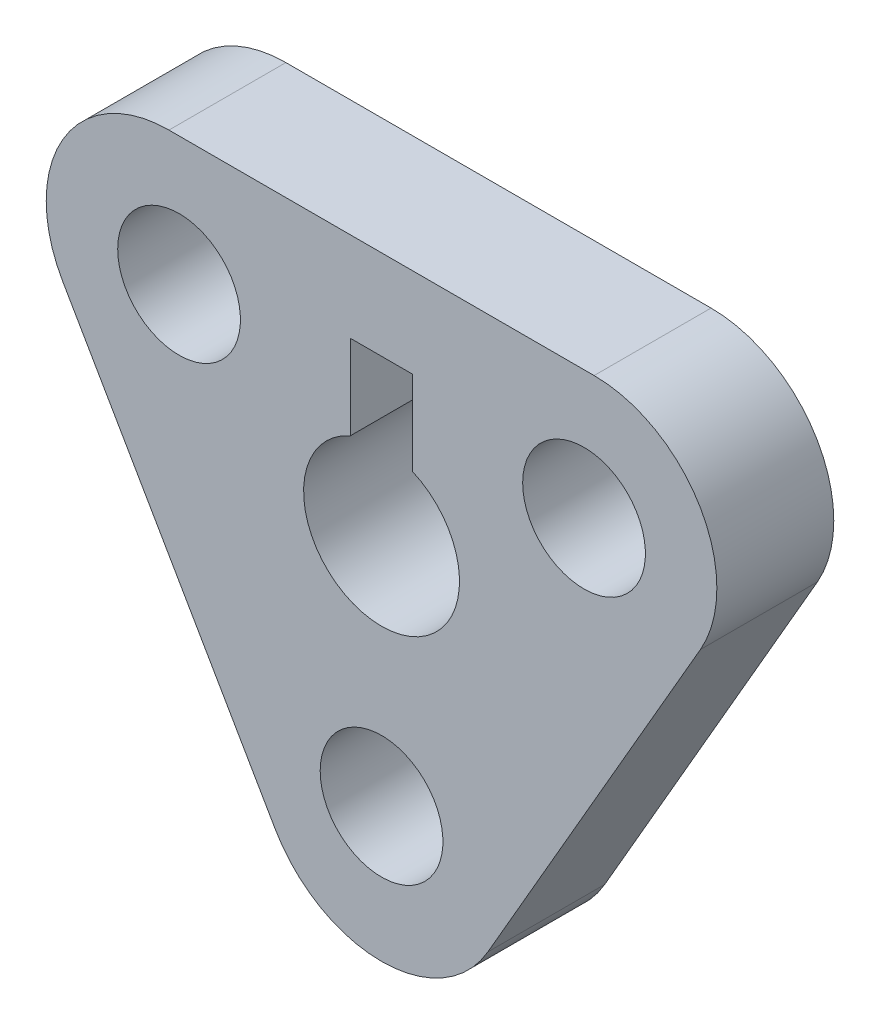
ISO-10303-21;
HEADER;
FILE_DESCRIPTION(('STEP AP214'),'2;1');
FILE_NAME('part.step','',(''),(''),'','','');
FILE_SCHEMA(('AUTOMOTIVE_DESIGN { 1 0 10303 214 1 1 1 1 }'));
ENDSEC;
DATA;
#1=APPLICATION_CONTEXT('core data for automotive mechanical design processes');
#2=APPLICATION_PROTOCOL_DEFINITION('international standard','automotive_design',2000,#1);
#3=PRODUCT_CONTEXT('',#1,'mechanical');
#4=PRODUCT('Part','Part','',(#3));
#5=PRODUCT_RELATED_PRODUCT_CATEGORY('part','',(#4));
#6=PRODUCT_DEFINITION_FORMATION('','',#4);
#7=PRODUCT_DEFINITION_CONTEXT('part definition',#1,'design');
#8=PRODUCT_DEFINITION('design','',#6,#7);
#9=PRODUCT_DEFINITION_SHAPE('','',#8);
#10=(LENGTH_UNIT() NAMED_UNIT(*) SI_UNIT(.MILLI.,.METRE.));
#11=(NAMED_UNIT(*) PLANE_ANGLE_UNIT() SI_UNIT($,.RADIAN.));
#12=(NAMED_UNIT(*) SI_UNIT($,.STERADIAN.) SOLID_ANGLE_UNIT());
#13=UNCERTAINTY_MEASURE_WITH_UNIT(LENGTH_MEASURE(1.E-05),#10,'distance_accuracy_value','');
#14=(GEOMETRIC_REPRESENTATION_CONTEXT(3) GLOBAL_UNCERTAINTY_ASSIGNED_CONTEXT((#13)) GLOBAL_UNIT_ASSIGNED_CONTEXT((#10,
#11,#12)) REPRESENTATION_CONTEXT('',''));
#15=CARTESIAN_POINT('',(0.,0.,0.));
#16=DIRECTION('',(0.,0.,1.));
#17=DIRECTION('',(1.,0.,0.));
#18=AXIS2_PLACEMENT_3D('',#15,#16,#17);
#19=CARTESIAN_POINT('',(0.,0.,9.525));
#20=DIRECTION('',(0.,0.,1.));
#21=DIRECTION('',(1.,0.,0.));
#22=AXIS2_PLACEMENT_3D('',#19,#20,#21);
#23=PLANE('',#22);
#24=CARTESIAN_POINT('',(16.4977839420936,9.52499999999999,9.525));
#25=DIRECTION('',(0.,0.,1.));
#26=DIRECTION('',(1.,0.,0.));
#27=AXIS2_PLACEMENT_3D('',#24,#25,#26);
#28=CIRCLE('',#27,5.);
#29=CARTESIAN_POINT('',(11.4977839420936,9.52499999999999,9.525));
#30=VERTEX_POINT('',#29);
#31=EDGE_CURVE('E147',#30,#30,#28,.T.);
#32=ORIENTED_EDGE('',*,*,#31,.F.);
#33=EDGE_LOOP('',(#32));
#34=FACE_BOUND('',#33,.T.);
#35=DIRECTION('',(0.5,-0.866025403784439,0.));
#36=VECTOR('',#35,1.);
#37=CARTESIAN_POINT('',(-34.6410161513775,20.,9.525));
#38=LINE('',#37,#36);
#39=CARTESIAN_POINT('',(-25.9807621135332,5.00000000000001,9.525));
#40=VERTEX_POINT('',#39);
#41=CARTESIAN_POINT('',(-8.6602540378444,-25.,9.525));
#42=VERTEX_POINT('',#41);
#43=EDGE_CURVE('E166',#40,#42,#38,.T.);
#44=ORIENTED_EDGE('',*,*,#43,.T.);
#45=CARTESIAN_POINT('',(0.,-20.,9.525));
#46=DIRECTION('',(0.,0.,1.));
#47=DIRECTION('',(1.,0.,0.));
#48=AXIS2_PLACEMENT_3D('',#45,#46,#47);
#49=CIRCLE('',#48,10.);
#50=CARTESIAN_POINT('',(8.66025403784437,-25.,9.525));
#51=VERTEX_POINT('',#50);
#52=EDGE_CURVE('E199',#42,#51,#49,.T.);
#53=ORIENTED_EDGE('',*,*,#52,.T.);
#54=DIRECTION('',(0.5,0.866025403784439,0.));
#55=VECTOR('',#54,1.);
#56=CARTESIAN_POINT('',(0.,-40.,9.525));
#57=LINE('',#56,#55);
#58=CARTESIAN_POINT('',(25.9807621135332,5.00000000000002,9.525));
#59=VERTEX_POINT('',#58);
#60=EDGE_CURVE('E170',#51,#59,#57,.T.);
#61=ORIENTED_EDGE('',*,*,#60,.T.);
#62=CARTESIAN_POINT('',(17.3205080756888,10.,9.525));
#63=DIRECTION('',(0.,0.,1.));
#64=DIRECTION('',(1.,0.,0.));
#65=AXIS2_PLACEMENT_3D('',#62,#63,#64);
#66=CIRCLE('',#65,10.);
#67=CARTESIAN_POINT('',(17.3205080756888,20.,9.525));
#68=VERTEX_POINT('',#67);
#69=EDGE_CURVE('E195',#59,#68,#66,.T.);
#70=ORIENTED_EDGE('',*,*,#69,.T.);
#71=DIRECTION('',(-1.,0.,0.));
#72=VECTOR('',#71,1.);
#73=CARTESIAN_POINT('',(34.6410161513775,20.,9.525));
#74=LINE('',#73,#72);
#75=CARTESIAN_POINT('',(-17.3205080756888,20.,9.525));
#76=VERTEX_POINT('',#75);
#77=EDGE_CURVE('E164',#68,#76,#74,.T.);
#78=ORIENTED_EDGE('',*,*,#77,.T.);
#79=CARTESIAN_POINT('',(-17.3205080756888,10.,9.525));
#80=DIRECTION('',(0.,0.,1.));
#81=DIRECTION('',(1.,0.,0.));
#82=AXIS2_PLACEMENT_3D('',#79,#80,#81);
#83=CIRCLE('',#82,10.);
#84=EDGE_CURVE('E197',#76,#40,#83,.T.);
#85=ORIENTED_EDGE('',*,*,#84,.T.);
#86=EDGE_LOOP('',(#44,#53,#61,#70,#78,#85));
#87=FACE_BOUND('',#86,.T.);
#88=CARTESIAN_POINT('',(-16.4977839420935,9.52500000000002,9.525));
#89=DIRECTION('',(0.,0.,1.));
#90=DIRECTION('',(1.,0.,0.));
#91=AXIS2_PLACEMENT_3D('',#88,#89,#90);
#92=CIRCLE('',#91,5.);
#93=CARTESIAN_POINT('',(-21.4977839420935,9.52500000000002,9.525));
#94=VERTEX_POINT('',#93);
#95=EDGE_CURVE('E153',#94,#94,#92,.T.);
#96=ORIENTED_EDGE('',*,*,#95,.F.);
#97=EDGE_LOOP('',(#96));
#98=FACE_BOUND('',#97,.T.);
#99=CARTESIAN_POINT('',(0.,-19.05,9.525));
#100=DIRECTION('',(0.,0.,1.));
#101=DIRECTION('',(1.,0.,0.));
#102=AXIS2_PLACEMENT_3D('',#99,#100,#101);
#103=CIRCLE('',#102,5.);
#104=CARTESIAN_POINT('',(-5.00000000000001,-19.05,9.525));
#105=VERTEX_POINT('',#104);
#106=EDGE_CURVE('E141',#105,#105,#103,.T.);
#107=ORIENTED_EDGE('',*,*,#106,.F.);
#108=EDGE_LOOP('',(#107));
#109=FACE_BOUND('',#108,.T.);
#110=CARTESIAN_POINT('',(0.,0.,9.525));
#111=DIRECTION('',(0.,0.,1.));
#112=DIRECTION('',(1.,0.,0.));
#113=AXIS2_PLACEMENT_3D('',#110,#111,#112);
#114=CIRCLE('',#113,6.35);
#115=CARTESIAN_POINT('',(-2.54,5.81987113259392,9.525));
#116=VERTEX_POINT('',#115);
#117=CARTESIAN_POINT('',(2.54,5.81987113259392,9.525));
#118=VERTEX_POINT('',#117);
#119=EDGE_CURVE('E159',#116,#118,#114,.T.);
#120=ORIENTED_EDGE('',*,*,#119,.F.);
#121=DIRECTION('',(0.,-1.,0.));
#122=VECTOR('',#121,1.);
#123=CARTESIAN_POINT('',(-2.54,12.7,9.525));
#124=LINE('',#123,#122);
#125=CARTESIAN_POINT('',(-2.54,12.7,9.525));
#126=VERTEX_POINT('',#125);
#127=EDGE_CURVE('E121',#126,#116,#124,.T.);
#128=ORIENTED_EDGE('',*,*,#127,.F.);
#129=DIRECTION('',(-1.,0.,0.));
#130=VECTOR('',#129,1.);
#131=CARTESIAN_POINT('',(-2.54,12.7,9.525));
#132=LINE('',#131,#130);
#133=CARTESIAN_POINT('',(2.54,12.7,9.525));
#134=VERTEX_POINT('',#133);
#135=EDGE_CURVE('E120',#134,#126,#132,.T.);
#136=ORIENTED_EDGE('',*,*,#135,.F.);
#137=DIRECTION('',(0.,1.,0.));
#138=VECTOR('',#137,1.);
#139=CARTESIAN_POINT('',(2.54,12.7,9.525));
#140=LINE('',#139,#138);
#141=EDGE_CURVE('E111',#118,#134,#140,.T.);
#142=ORIENTED_EDGE('',*,*,#141,.F.);
#143=EDGE_LOOP('',(#120,#128,#136,#142));
#144=FACE_BOUND('',#143,.T.);
#145=ADVANCED_FACE('F34',(#34,#87,#98,#109,#144),#23,.T.);
#146=CARTESIAN_POINT('',(0.,0.,0.));
#147=DIRECTION('',(0.,0.,1.));
#148=DIRECTION('',(1.,0.,0.));
#149=AXIS2_PLACEMENT_3D('',#146,#147,#148);
#150=PLANE('',#149);
#151=CARTESIAN_POINT('',(0.,-19.05,0.));
#152=DIRECTION('',(0.,0.,1.));
#153=DIRECTION('',(1.,0.,0.));
#154=AXIS2_PLACEMENT_3D('',#151,#152,#153);
#155=CIRCLE('',#154,5.);
#156=CARTESIAN_POINT('',(-5.00000000000001,-19.05,0.));
#157=VERTEX_POINT('',#156);
#158=EDGE_CURVE('E128',#157,#157,#155,.T.);
#159=ORIENTED_EDGE('',*,*,#158,.T.);
#160=EDGE_LOOP('',(#159));
#161=FACE_BOUND('',#160,.T.);
#162=CARTESIAN_POINT('',(16.4977839420936,9.52499999999999,0.));
#163=DIRECTION('',(0.,0.,1.));
#164=DIRECTION('',(1.,0.,0.));
#165=AXIS2_PLACEMENT_3D('',#162,#163,#164);
#166=CIRCLE('',#165,5.);
#167=CARTESIAN_POINT('',(11.4977839420936,9.52499999999999,0.));
#168=VERTEX_POINT('',#167);
#169=EDGE_CURVE('E144',#168,#168,#166,.T.);
#170=ORIENTED_EDGE('',*,*,#169,.T.);
#171=EDGE_LOOP('',(#170));
#172=FACE_BOUND('',#171,.T.);
#173=CARTESIAN_POINT('',(-16.4977839420935,9.52500000000002,0.));
#174=DIRECTION('',(0.,0.,1.));
#175=DIRECTION('',(1.,0.,0.));
#176=AXIS2_PLACEMENT_3D('',#173,#174,#175);
#177=CIRCLE('',#176,5.);
#178=CARTESIAN_POINT('',(-21.4977839420935,9.52500000000002,0.));
#179=VERTEX_POINT('',#178);
#180=EDGE_CURVE('E150',#179,#179,#177,.T.);
#181=ORIENTED_EDGE('',*,*,#180,.T.);
#182=EDGE_LOOP('',(#181));
#183=FACE_BOUND('',#182,.T.);
#184=DIRECTION('',(0.5,0.866025403784439,0.));
#185=VECTOR('',#184,1.);
#186=CARTESIAN_POINT('',(0.,-40.,0.));
#187=LINE('',#186,#185);
#188=CARTESIAN_POINT('',(8.66025403784437,-25.,0.));
#189=VERTEX_POINT('',#188);
#190=CARTESIAN_POINT('',(25.9807621135332,5.00000000000002,0.));
#191=VERTEX_POINT('',#190);
#192=EDGE_CURVE('E167',#189,#191,#187,.T.);
#193=ORIENTED_EDGE('',*,*,#192,.F.);
#194=CARTESIAN_POINT('',(0.,-20.,0.));
#195=DIRECTION('',(0.,0.,1.));
#196=DIRECTION('',(1.,0.,0.));
#197=AXIS2_PLACEMENT_3D('',#194,#195,#196);
#198=CIRCLE('',#197,10.);
#199=CARTESIAN_POINT('',(-8.6602540378444,-25.,0.));
#200=VERTEX_POINT('',#199);
#201=EDGE_CURVE('E188',#189,#200,#198,.F.);
#202=ORIENTED_EDGE('',*,*,#201,.T.);
#203=DIRECTION('',(0.5,-0.866025403784439,0.));
#204=VECTOR('',#203,1.);
#205=CARTESIAN_POINT('',(-34.6410161513775,20.,0.));
#206=LINE('',#205,#204);
#207=CARTESIAN_POINT('',(-25.9807621135332,5.00000000000001,0.));
#208=VERTEX_POINT('',#207);
#209=EDGE_CURVE('E175',#208,#200,#206,.T.);
#210=ORIENTED_EDGE('',*,*,#209,.F.);
#211=CARTESIAN_POINT('',(-17.3205080756888,10.,0.));
#212=DIRECTION('',(0.,0.,1.));
#213=DIRECTION('',(1.,0.,0.));
#214=AXIS2_PLACEMENT_3D('',#211,#212,#213);
#215=CIRCLE('',#214,10.);
#216=CARTESIAN_POINT('',(-17.3205080756888,20.,0.));
#217=VERTEX_POINT('',#216);
#218=EDGE_CURVE('E186',#208,#217,#215,.F.);
#219=ORIENTED_EDGE('',*,*,#218,.T.);
#220=DIRECTION('',(-1.,0.,0.));
#221=VECTOR('',#220,1.);
#222=CARTESIAN_POINT('',(34.6410161513775,20.,0.));
#223=LINE('',#222,#221);
#224=CARTESIAN_POINT('',(17.3205080756888,20.,0.));
#225=VERTEX_POINT('',#224);
#226=EDGE_CURVE('E161',#225,#217,#223,.T.);
#227=ORIENTED_EDGE('',*,*,#226,.F.);
#228=CARTESIAN_POINT('',(17.3205080756888,10.,0.));
#229=DIRECTION('',(0.,0.,1.));
#230=DIRECTION('',(1.,0.,0.));
#231=AXIS2_PLACEMENT_3D('',#228,#229,#230);
#232=CIRCLE('',#231,10.);
#233=EDGE_CURVE('E184',#225,#191,#232,.F.);
#234=ORIENTED_EDGE('',*,*,#233,.T.);
#235=EDGE_LOOP('',(#193,#202,#210,#219,#227,#234));
#236=FACE_BOUND('',#235,.T.);
#237=DIRECTION('',(0.,-1.,0.));
#238=VECTOR('',#237,1.);
#239=CARTESIAN_POINT('',(-2.54,12.7,0.));
#240=LINE('',#239,#238);
#241=CARTESIAN_POINT('',(-2.54,12.7,0.));
#242=VERTEX_POINT('',#241);
#243=CARTESIAN_POINT('',(-2.54,5.81987113259392,0.));
#244=VERTEX_POINT('',#243);
#245=EDGE_CURVE('E136',#242,#244,#240,.T.);
#246=ORIENTED_EDGE('',*,*,#245,.T.);
#247=CARTESIAN_POINT('',(0.,0.,0.));
#248=DIRECTION('',(0.,0.,1.));
#249=DIRECTION('',(1.,0.,0.));
#250=AXIS2_PLACEMENT_3D('',#247,#248,#249);
#251=CIRCLE('',#250,6.35);
#252=CARTESIAN_POINT('',(2.54,5.81987113259392,0.));
#253=VERTEX_POINT('',#252);
#254=EDGE_CURVE('E156',#244,#253,#251,.T.);
#255=ORIENTED_EDGE('',*,*,#254,.T.);
#256=DIRECTION('',(0.,1.,0.));
#257=VECTOR('',#256,1.);
#258=CARTESIAN_POINT('',(2.54,12.7,0.));
#259=LINE('',#258,#257);
#260=CARTESIAN_POINT('',(2.54,12.7,0.));
#261=VERTEX_POINT('',#260);
#262=EDGE_CURVE('E49',#253,#261,#259,.T.);
#263=ORIENTED_EDGE('',*,*,#262,.T.);
#264=DIRECTION('',(-1.,0.,0.));
#265=VECTOR('',#264,1.);
#266=CARTESIAN_POINT('',(-2.54,12.7,0.));
#267=LINE('',#266,#265);
#268=EDGE_CURVE('E127',#261,#242,#267,.T.);
#269=ORIENTED_EDGE('',*,*,#268,.T.);
#270=EDGE_LOOP('',(#246,#255,#263,#269));
#271=FACE_BOUND('',#270,.T.);
#272=ADVANCED_FACE('F208',(#161,#172,#183,#236,#271),#150,.F.);
#273=CARTESIAN_POINT('',(0.,0.,9.525));
#274=DIRECTION('',(0.,0.,-1.));
#275=DIRECTION('',(-1.,0.,0.));
#276=AXIS2_PLACEMENT_3D('',#273,#274,#275);
#277=CYLINDRICAL_SURFACE('',#276,6.35);
#278=ORIENTED_EDGE('',*,*,#254,.F.);
#279=DIRECTION('',(0.,0.,-1.));
#280=VECTOR('',#279,1.);
#281=CARTESIAN_POINT('',(-2.54,5.81987113259392,9.525));
#282=LINE('',#281,#280);
#283=EDGE_CURVE('E11',#244,#116,#282,.F.);
#284=ORIENTED_EDGE('',*,*,#283,.T.);
#285=ORIENTED_EDGE('',*,*,#119,.T.);
#286=DIRECTION('',(0.,0.,-1.));
#287=VECTOR('',#286,1.);
#288=CARTESIAN_POINT('',(2.54,5.81987113259392,9.525));
#289=LINE('',#288,#287);
#290=EDGE_CURVE('E42',#118,#253,#289,.T.);
#291=ORIENTED_EDGE('',*,*,#290,.T.);
#292=EDGE_LOOP('',(#278,#284,#285,#291));
#293=FACE_BOUND('',#292,.T.);
#294=ADVANCED_FACE('F206',(#293),#277,.F.);
#295=CARTESIAN_POINT('',(34.6410161513775,20.,9.525));
#296=DIRECTION('',(0.,-1.,0.));
#297=DIRECTION('',(0.,0.,-1.));
#298=AXIS2_PLACEMENT_3D('',#295,#296,#297);
#299=PLANE('',#298);
#300=ORIENTED_EDGE('',*,*,#226,.T.);
#301=DIRECTION('',(0.,0.,-1.));
#302=VECTOR('',#301,1.);
#303=CARTESIAN_POINT('',(-17.3205080756888,20.,9.525));
#304=LINE('',#303,#302);
#305=EDGE_CURVE('E57',#217,#76,#304,.F.);
#306=ORIENTED_EDGE('',*,*,#305,.T.);
#307=ORIENTED_EDGE('',*,*,#77,.F.);
#308=DIRECTION('',(0.,0.,-1.));
#309=VECTOR('',#308,1.);
#310=CARTESIAN_POINT('',(17.3205080756888,20.,9.525));
#311=LINE('',#310,#309);
#312=EDGE_CURVE('E201',#68,#225,#311,.T.);
#313=ORIENTED_EDGE('',*,*,#312,.T.);
#314=EDGE_LOOP('',(#300,#306,#307,#313));
#315=FACE_BOUND('',#314,.T.);
#316=ADVANCED_FACE('F243',(#315),#299,.F.);
#317=CARTESIAN_POINT('',(-34.6410161513775,20.,9.525));
#318=DIRECTION('',(0.866025403784439,0.5,0.));
#319=DIRECTION('',(-0.5,0.866025403784439,0.));
#320=AXIS2_PLACEMENT_3D('',#317,#318,#319);
#321=PLANE('',#320);
#322=ORIENTED_EDGE('',*,*,#209,.T.);
#323=DIRECTION('',(0.,0.,-1.));
#324=VECTOR('',#323,1.);
#325=CARTESIAN_POINT('',(-8.66025403784441,-25.,9.525));
#326=LINE('',#325,#324);
#327=EDGE_CURVE('E193',#200,#42,#326,.F.);
#328=ORIENTED_EDGE('',*,*,#327,.T.);
#329=ORIENTED_EDGE('',*,*,#43,.F.);
#330=DIRECTION('',(0.,0.,-1.));
#331=VECTOR('',#330,1.);
#332=CARTESIAN_POINT('',(-25.9807621135332,5.00000000000001,9.525));
#333=LINE('',#332,#331);
#334=EDGE_CURVE('E190',#40,#208,#333,.T.);
#335=ORIENTED_EDGE('',*,*,#334,.T.);
#336=EDGE_LOOP('',(#322,#328,#329,#335));
#337=FACE_BOUND('',#336,.T.);
#338=ADVANCED_FACE('F239',(#337),#321,.F.);
#339=CARTESIAN_POINT('',(0.,-40.,9.525));
#340=DIRECTION('',(-0.866025403784439,0.5,0.));
#341=DIRECTION('',(-0.5,-0.866025403784439,0.));
#342=AXIS2_PLACEMENT_3D('',#339,#340,#341);
#343=PLANE('',#342);
#344=ORIENTED_EDGE('',*,*,#60,.F.);
#345=DIRECTION('',(0.,0.,-1.));
#346=VECTOR('',#345,1.);
#347=CARTESIAN_POINT('',(8.66025403784437,-25.,9.525));
#348=LINE('',#347,#346);
#349=EDGE_CURVE('E181',#51,#189,#348,.T.);
#350=ORIENTED_EDGE('',*,*,#349,.T.);
#351=ORIENTED_EDGE('',*,*,#192,.T.);
#352=DIRECTION('',(0.,0.,-1.));
#353=VECTOR('',#352,1.);
#354=CARTESIAN_POINT('',(25.9807621135332,5.00000000000001,9.525));
#355=LINE('',#354,#353);
#356=EDGE_CURVE('E173',#191,#59,#355,.F.);
#357=ORIENTED_EDGE('',*,*,#356,.T.);
#358=EDGE_LOOP('',(#344,#350,#351,#357));
#359=FACE_BOUND('',#358,.T.);
#360=ADVANCED_FACE('F235',(#359),#343,.F.);
#361=CARTESIAN_POINT('',(-16.4977839420935,9.52500000000002,9.525));
#362=DIRECTION('',(0.,0.,-1.));
#363=DIRECTION('',(-1.,0.,0.));
#364=AXIS2_PLACEMENT_3D('',#361,#362,#363);
#365=CYLINDRICAL_SURFACE('',#364,5.);
#366=CARTESIAN_POINT('',(-21.4977839420935,9.52500000000002,9.525));
#367=CARTESIAN_POINT('',(-21.4977839420935,9.52500000000002,9.42578125));
#368=CARTESIAN_POINT('',(-21.4977839420935,9.52500000000002,9.3265625));
#369=CARTESIAN_POINT('',(-21.4977839420935,9.52500000000002,9.128125));
#370=CARTESIAN_POINT('',(-21.4977839420935,9.52500000000002,9.02890625));
#371=CARTESIAN_POINT('',(-21.4977839420935,9.52500000000002,8.83046875));
#372=CARTESIAN_POINT('',(-21.4977839420935,9.52500000000002,8.73125));
#373=CARTESIAN_POINT('',(-21.4977839420935,9.52500000000002,8.5328125));
#374=CARTESIAN_POINT('',(-21.4977839420935,9.52500000000002,8.43359375));
#375=CARTESIAN_POINT('',(-21.4977839420935,9.52500000000002,8.23515625));
#376=CARTESIAN_POINT('',(-21.4977839420935,9.52500000000002,8.1359375));
#377=CARTESIAN_POINT('',(-21.4977839420935,9.52500000000002,7.9375));
#378=CARTESIAN_POINT('',(-21.4977839420935,9.52500000000002,7.83828125));
#379=CARTESIAN_POINT('',(-21.4977839420935,9.52500000000002,7.63984375));
#380=CARTESIAN_POINT('',(-21.4977839420935,9.52500000000002,7.540625));
#381=CARTESIAN_POINT('',(-21.4977839420935,9.52500000000002,7.3421875));
#382=CARTESIAN_POINT('',(-21.4977839420935,9.52500000000002,7.24296875));
#383=CARTESIAN_POINT('',(-21.4977839420935,9.52500000000002,7.04453125));
#384=CARTESIAN_POINT('',(-21.4977839420935,9.52500000000002,6.9453125));
#385=CARTESIAN_POINT('',(-21.4977839420935,9.52500000000002,6.746875));
#386=CARTESIAN_POINT('',(-21.4977839420935,9.52500000000002,6.64765625));
#387=CARTESIAN_POINT('',(-21.4977839420935,9.52500000000002,6.44921875));
#388=CARTESIAN_POINT('',(-21.4977839420935,9.52500000000002,6.35));
#389=CARTESIAN_POINT('',(-21.4977839420935,9.52500000000002,6.1515625));
#390=CARTESIAN_POINT('',(-21.4977839420935,9.52500000000002,6.05234375));
#391=CARTESIAN_POINT('',(-21.4977839420935,9.52500000000002,5.85390625));
#392=CARTESIAN_POINT('',(-21.4977839420935,9.52500000000002,5.7546875));
#393=CARTESIAN_POINT('',(-21.4977839420935,9.52500000000002,5.55625));
#394=CARTESIAN_POINT('',(-21.4977839420935,9.52500000000002,5.45703125));
#395=CARTESIAN_POINT('',(-21.4977839420935,9.52500000000002,5.25859375));
#396=CARTESIAN_POINT('',(-21.4977839420935,9.52500000000002,5.159375));
#397=CARTESIAN_POINT('',(-21.4977839420935,9.52500000000002,4.9609375));
#398=CARTESIAN_POINT('',(-21.4977839420935,9.52500000000002,4.86171875));
#399=CARTESIAN_POINT('',(-21.4977839420935,9.52500000000002,4.66328125));
#400=CARTESIAN_POINT('',(-21.4977839420935,9.52500000000002,4.5640625));
#401=CARTESIAN_POINT('',(-21.4977839420935,9.52500000000002,4.365625));
#402=CARTESIAN_POINT('',(-21.4977839420935,9.52500000000002,4.26640625));
#403=CARTESIAN_POINT('',(-21.4977839420935,9.52500000000002,4.06796875));
#404=CARTESIAN_POINT('',(-21.4977839420935,9.52500000000002,3.96875));
#405=CARTESIAN_POINT('',(-21.4977839420935,9.52500000000002,3.7703125));
#406=CARTESIAN_POINT('',(-21.4977839420935,9.52500000000002,3.67109375));
#407=CARTESIAN_POINT('',(-21.4977839420935,9.52500000000002,3.47265625));
#408=CARTESIAN_POINT('',(-21.4977839420935,9.52500000000002,3.3734375));
#409=CARTESIAN_POINT('',(-21.4977839420935,9.52500000000002,3.175));
#410=CARTESIAN_POINT('',(-21.4977839420935,9.52500000000002,3.07578125));
#411=CARTESIAN_POINT('',(-21.4977839420935,9.52500000000002,2.87734375));
#412=CARTESIAN_POINT('',(-21.4977839420935,9.52500000000002,2.778125));
#413=CARTESIAN_POINT('',(-21.4977839420935,9.52500000000002,2.5796875));
#414=CARTESIAN_POINT('',(-21.4977839420935,9.52500000000002,2.48046875));
#415=CARTESIAN_POINT('',(-21.4977839420935,9.52500000000002,2.28203125));
#416=CARTESIAN_POINT('',(-21.4977839420935,9.52500000000002,2.1828125));
#417=CARTESIAN_POINT('',(-21.4977839420935,9.52500000000002,1.984375));
#418=CARTESIAN_POINT('',(-21.4977839420935,9.52500000000002,1.88515625));
#419=CARTESIAN_POINT('',(-21.4977839420935,9.52500000000002,1.68671875));
#420=CARTESIAN_POINT('',(-21.4977839420935,9.52500000000002,1.5875));
#421=CARTESIAN_POINT('',(-21.4977839420935,9.52500000000002,1.3890625));
#422=CARTESIAN_POINT('',(-21.4977839420935,9.52500000000002,1.28984375));
#423=CARTESIAN_POINT('',(-21.4977839420935,9.52500000000002,1.09140625));
#424=CARTESIAN_POINT('',(-21.4977839420935,9.52500000000002,0.992187500000001));
#425=CARTESIAN_POINT('',(-21.4977839420935,9.52500000000002,0.793750000000001));
#426=CARTESIAN_POINT('',(-21.4977839420935,9.52500000000002,0.69453125));
#427=CARTESIAN_POINT('',(-21.4977839420935,9.52500000000002,0.49609375));
#428=CARTESIAN_POINT('',(-21.4977839420935,9.52500000000002,0.396875));
#429=CARTESIAN_POINT('',(-21.4977839420935,9.52500000000002,0.1984375));
#430=CARTESIAN_POINT('',(-21.4977839420935,9.52500000000002,0.0992187500000001));
#431=CARTESIAN_POINT('',(-21.4977839420935,9.52500000000002,0.));
#432=B_SPLINE_CURVE_WITH_KNOTS('',3,(#366,#367,#368,#369,#370,#371,#372,#373,#374,#375,#376,
#377,#378,#379,#380,#381,#382,#383,#384,#385,#386,#387,#388,#389,#390,#391,#392,#393,#394,#395,
#396,#397,#398,#399,#400,#401,#402,#403,#404,#405,#406,#407,#408,#409,#410,#411,#412,#413,#414,
#415,#416,#417,#418,#419,#420,#421,#422,#423,#424,#425,#426,#427,#428,#429,#430,#431),
.UNSPECIFIED.,.F.,.F.,(4,2,2,2,2,2,2,2,2,2,2,2,2,2,2,2,2,2,2,2,2,2,2,2,2,2,2,2,2,2,2,2,4),(0.,
0.29765625,0.5953125,0.892968750000001,1.190625,1.48828125,1.7859375,2.08359375,2.38125,
2.67890625,2.9765625,3.27421875,3.571875,3.86953125,4.1671875,4.46484375,4.7625,5.06015625,
5.3578125,5.65546875,5.953125,6.25078125,6.5484375,6.84609375,7.14375,7.44140625,7.7390625,
8.03671875,8.334375,8.63203125,8.9296875,9.22734375,9.525),.UNSPECIFIED.);
#433=EDGE_CURVE('BSEAM238',#94,#179,#432,.T.);
#434=ORIENTED_EDGE('',*,*,#95,.T.);
#435=ORIENTED_EDGE('',*,*,#180,.F.);
#436=ORIENTED_EDGE('',*,*,#433,.T.);
#437=ORIENTED_EDGE('',*,*,#433,.F.);
#438=EDGE_LOOP('',(#434,#436,#435,#437));
#439=FACE_BOUND('',#438,.T.);
#440=ADVANCED_FACE('F238',(#439),#365,.F.);
#441=CARTESIAN_POINT('',(16.4977839420936,9.52499999999999,9.525));
#442=DIRECTION('',(0.,0.,-1.));
#443=DIRECTION('',(-1.,0.,0.));
#444=AXIS2_PLACEMENT_3D('',#441,#442,#443);
#445=CYLINDRICAL_SURFACE('',#444,5.);
#446=CARTESIAN_POINT('',(11.4977839420936,9.52499999999999,9.525));
#447=CARTESIAN_POINT('',(11.4977839420936,9.52499999999999,9.42578125));
#448=CARTESIAN_POINT('',(11.4977839420936,9.52499999999999,9.3265625));
#449=CARTESIAN_POINT('',(11.4977839420936,9.52499999999999,9.128125));
#450=CARTESIAN_POINT('',(11.4977839420936,9.52499999999999,9.02890625));
#451=CARTESIAN_POINT('',(11.4977839420936,9.52499999999999,8.83046875));
#452=CARTESIAN_POINT('',(11.4977839420936,9.52499999999999,8.73125));
#453=CARTESIAN_POINT('',(11.4977839420936,9.52499999999999,8.5328125));
#454=CARTESIAN_POINT('',(11.4977839420936,9.52499999999999,8.43359375));
#455=CARTESIAN_POINT('',(11.4977839420936,9.52499999999999,8.23515625));
#456=CARTESIAN_POINT('',(11.4977839420936,9.52499999999999,8.1359375));
#457=CARTESIAN_POINT('',(11.4977839420936,9.52499999999999,7.9375));
#458=CARTESIAN_POINT('',(11.4977839420936,9.52499999999999,7.83828125));
#459=CARTESIAN_POINT('',(11.4977839420936,9.52499999999999,7.63984375));
#460=CARTESIAN_POINT('',(11.4977839420936,9.52499999999999,7.540625));
#461=CARTESIAN_POINT('',(11.4977839420936,9.52499999999999,7.3421875));
#462=CARTESIAN_POINT('',(11.4977839420936,9.52499999999999,7.24296875));
#463=CARTESIAN_POINT('',(11.4977839420936,9.52499999999999,7.04453125));
#464=CARTESIAN_POINT('',(11.4977839420936,9.52499999999999,6.9453125));
#465=CARTESIAN_POINT('',(11.4977839420936,9.52499999999999,6.746875));
#466=CARTESIAN_POINT('',(11.4977839420936,9.52499999999999,6.64765625));
#467=CARTESIAN_POINT('',(11.4977839420936,9.52499999999999,6.44921875));
#468=CARTESIAN_POINT('',(11.4977839420936,9.52499999999999,6.35));
#469=CARTESIAN_POINT('',(11.4977839420936,9.52499999999999,6.1515625));
#470=CARTESIAN_POINT('',(11.4977839420936,9.52499999999999,6.05234375));
#471=CARTESIAN_POINT('',(11.4977839420936,9.52499999999999,5.85390625));
#472=CARTESIAN_POINT('',(11.4977839420936,9.52499999999999,5.7546875));
#473=CARTESIAN_POINT('',(11.4977839420936,9.52499999999999,5.55625));
#474=CARTESIAN_POINT('',(11.4977839420936,9.52499999999999,5.45703125));
#475=CARTESIAN_POINT('',(11.4977839420936,9.52499999999999,5.25859375));
#476=CARTESIAN_POINT('',(11.4977839420936,9.52499999999999,5.159375));
#477=CARTESIAN_POINT('',(11.4977839420936,9.52499999999999,4.9609375));
#478=CARTESIAN_POINT('',(11.4977839420936,9.52499999999999,4.86171875));
#479=CARTESIAN_POINT('',(11.4977839420936,9.52499999999999,4.66328125));
#480=CARTESIAN_POINT('',(11.4977839420936,9.52499999999999,4.5640625));
#481=CARTESIAN_POINT('',(11.4977839420936,9.52499999999999,4.365625));
#482=CARTESIAN_POINT('',(11.4977839420936,9.52499999999999,4.26640625));
#483=CARTESIAN_POINT('',(11.4977839420936,9.52499999999999,4.06796875));
#484=CARTESIAN_POINT('',(11.4977839420936,9.52499999999999,3.96875));
#485=CARTESIAN_POINT('',(11.4977839420936,9.52499999999999,3.7703125));
#486=CARTESIAN_POINT('',(11.4977839420936,9.52499999999999,3.67109375));
#487=CARTESIAN_POINT('',(11.4977839420936,9.52499999999999,3.47265625));
#488=CARTESIAN_POINT('',(11.4977839420936,9.52499999999999,3.3734375));
#489=CARTESIAN_POINT('',(11.4977839420936,9.52499999999999,3.175));
#490=CARTESIAN_POINT('',(11.4977839420936,9.52499999999999,3.07578125));
#491=CARTESIAN_POINT('',(11.4977839420936,9.52499999999999,2.87734375));
#492=CARTESIAN_POINT('',(11.4977839420936,9.52499999999999,2.778125));
#493=CARTESIAN_POINT('',(11.4977839420936,9.52499999999999,2.5796875));
#494=CARTESIAN_POINT('',(11.4977839420936,9.52499999999999,2.48046875));
#495=CARTESIAN_POINT('',(11.4977839420936,9.52499999999999,2.28203125));
#496=CARTESIAN_POINT('',(11.4977839420936,9.52499999999999,2.1828125));
#497=CARTESIAN_POINT('',(11.4977839420936,9.52499999999999,1.984375));
#498=CARTESIAN_POINT('',(11.4977839420936,9.52499999999999,1.88515625));
#499=CARTESIAN_POINT('',(11.4977839420936,9.52499999999999,1.68671875));
#500=CARTESIAN_POINT('',(11.4977839420936,9.52499999999999,1.5875));
#501=CARTESIAN_POINT('',(11.4977839420936,9.52499999999999,1.3890625));
#502=CARTESIAN_POINT('',(11.4977839420936,9.52499999999999,1.28984375));
#503=CARTESIAN_POINT('',(11.4977839420936,9.52499999999999,1.09140625));
#504=CARTESIAN_POINT('',(11.4977839420936,9.52499999999999,0.992187500000001));
#505=CARTESIAN_POINT('',(11.4977839420936,9.52499999999999,0.793750000000001));
#506=CARTESIAN_POINT('',(11.4977839420936,9.52499999999999,0.69453125));
#507=CARTESIAN_POINT('',(11.4977839420936,9.52499999999999,0.49609375));
#508=CARTESIAN_POINT('',(11.4977839420936,9.52499999999999,0.396875));
#509=CARTESIAN_POINT('',(11.4977839420936,9.52499999999999,0.1984375));
#510=CARTESIAN_POINT('',(11.4977839420936,9.52499999999999,0.0992187500000001));
#511=CARTESIAN_POINT('',(11.4977839420936,9.52499999999999,0.));
#512=B_SPLINE_CURVE_WITH_KNOTS('',3,(#446,#447,#448,#449,#450,#451,#452,#453,#454,#455,#456,
#457,#458,#459,#460,#461,#462,#463,#464,#465,#466,#467,#468,#469,#470,#471,#472,#473,#474,#475,
#476,#477,#478,#479,#480,#481,#482,#483,#484,#485,#486,#487,#488,#489,#490,#491,#492,#493,#494,
#495,#496,#497,#498,#499,#500,#501,#502,#503,#504,#505,#506,#507,#508,#509,#510,#511),
.UNSPECIFIED.,.F.,.F.,(4,2,2,2,2,2,2,2,2,2,2,2,2,2,2,2,2,2,2,2,2,2,2,2,2,2,2,2,2,2,2,2,4),(0.,
0.29765625,0.5953125,0.892968750000001,1.190625,1.48828125,1.7859375,2.08359375,2.38125,
2.67890625,2.9765625,3.27421875,3.571875,3.86953125,4.1671875,4.46484375,4.7625,5.06015625,
5.3578125,5.65546875,5.953125,6.25078125,6.5484375,6.84609375,7.14375,7.44140625,7.7390625,
8.03671875,8.334375,8.63203125,8.9296875,9.22734375,9.525),.UNSPECIFIED.);
#513=EDGE_CURVE('BSEAM276',#30,#168,#512,.T.);
#514=ORIENTED_EDGE('',*,*,#31,.T.);
#515=ORIENTED_EDGE('',*,*,#169,.F.);
#516=ORIENTED_EDGE('',*,*,#513,.T.);
#517=ORIENTED_EDGE('',*,*,#513,.F.);
#518=EDGE_LOOP('',(#514,#516,#515,#517));
#519=FACE_BOUND('',#518,.T.);
#520=ADVANCED_FACE('F276',(#519),#445,.F.);
#521=CARTESIAN_POINT('',(0.,-19.05,9.525));
#522=DIRECTION('',(0.,0.,-1.));
#523=DIRECTION('',(-1.,0.,0.));
#524=AXIS2_PLACEMENT_3D('',#521,#522,#523);
#525=CYLINDRICAL_SURFACE('',#524,5.);
#526=CARTESIAN_POINT('',(-5.00000000000001,-19.05,9.525));
#527=CARTESIAN_POINT('',(-5.00000000000001,-19.05,9.42578125));
#528=CARTESIAN_POINT('',(-5.00000000000001,-19.05,9.3265625));
#529=CARTESIAN_POINT('',(-5.00000000000001,-19.05,9.128125));
#530=CARTESIAN_POINT('',(-5.00000000000001,-19.05,9.02890625));
#531=CARTESIAN_POINT('',(-5.00000000000001,-19.05,8.83046875));
#532=CARTESIAN_POINT('',(-5.00000000000001,-19.05,8.73125));
#533=CARTESIAN_POINT('',(-5.00000000000001,-19.05,8.5328125));
#534=CARTESIAN_POINT('',(-5.00000000000001,-19.05,8.43359375));
#535=CARTESIAN_POINT('',(-5.00000000000001,-19.05,8.23515625));
#536=CARTESIAN_POINT('',(-5.00000000000001,-19.05,8.1359375));
#537=CARTESIAN_POINT('',(-5.00000000000001,-19.05,7.9375));
#538=CARTESIAN_POINT('',(-5.00000000000001,-19.05,7.83828125));
#539=CARTESIAN_POINT('',(-5.00000000000001,-19.05,7.63984375));
#540=CARTESIAN_POINT('',(-5.00000000000001,-19.05,7.540625));
#541=CARTESIAN_POINT('',(-5.00000000000001,-19.05,7.3421875));
#542=CARTESIAN_POINT('',(-5.00000000000001,-19.05,7.24296875));
#543=CARTESIAN_POINT('',(-5.00000000000001,-19.05,7.04453125));
#544=CARTESIAN_POINT('',(-5.00000000000001,-19.05,6.9453125));
#545=CARTESIAN_POINT('',(-5.00000000000001,-19.05,6.746875));
#546=CARTESIAN_POINT('',(-5.00000000000001,-19.05,6.64765625));
#547=CARTESIAN_POINT('',(-5.00000000000001,-19.05,6.44921875));
#548=CARTESIAN_POINT('',(-5.00000000000001,-19.05,6.35));
#549=CARTESIAN_POINT('',(-5.00000000000001,-19.05,6.1515625));
#550=CARTESIAN_POINT('',(-5.00000000000001,-19.05,6.05234375));
#551=CARTESIAN_POINT('',(-5.00000000000001,-19.05,5.85390625));
#552=CARTESIAN_POINT('',(-5.00000000000001,-19.05,5.7546875));
#553=CARTESIAN_POINT('',(-5.00000000000001,-19.05,5.55625));
#554=CARTESIAN_POINT('',(-5.00000000000001,-19.05,5.45703125));
#555=CARTESIAN_POINT('',(-5.00000000000001,-19.05,5.25859375));
#556=CARTESIAN_POINT('',(-5.00000000000001,-19.05,5.159375));
#557=CARTESIAN_POINT('',(-5.00000000000001,-19.05,4.9609375));
#558=CARTESIAN_POINT('',(-5.00000000000001,-19.05,4.86171875));
#559=CARTESIAN_POINT('',(-5.00000000000001,-19.05,4.66328125));
#560=CARTESIAN_POINT('',(-5.00000000000001,-19.05,4.5640625));
#561=CARTESIAN_POINT('',(-5.00000000000001,-19.05,4.365625));
#562=CARTESIAN_POINT('',(-5.00000000000001,-19.05,4.26640625));
#563=CARTESIAN_POINT('',(-5.00000000000001,-19.05,4.06796875));
#564=CARTESIAN_POINT('',(-5.00000000000001,-19.05,3.96875));
#565=CARTESIAN_POINT('',(-5.00000000000001,-19.05,3.7703125));
#566=CARTESIAN_POINT('',(-5.00000000000001,-19.05,3.67109375));
#567=CARTESIAN_POINT('',(-5.00000000000001,-19.05,3.47265625));
#568=CARTESIAN_POINT('',(-5.00000000000001,-19.05,3.3734375));
#569=CARTESIAN_POINT('',(-5.00000000000001,-19.05,3.175));
#570=CARTESIAN_POINT('',(-5.00000000000001,-19.05,3.07578125));
#571=CARTESIAN_POINT('',(-5.00000000000001,-19.05,2.87734375));
#572=CARTESIAN_POINT('',(-5.00000000000001,-19.05,2.778125));
#573=CARTESIAN_POINT('',(-5.00000000000001,-19.05,2.5796875));
#574=CARTESIAN_POINT('',(-5.00000000000001,-19.05,2.48046875));
#575=CARTESIAN_POINT('',(-5.00000000000001,-19.05,2.28203125));
#576=CARTESIAN_POINT('',(-5.00000000000001,-19.05,2.1828125));
#577=CARTESIAN_POINT('',(-5.00000000000001,-19.05,1.984375));
#578=CARTESIAN_POINT('',(-5.00000000000001,-19.05,1.88515625));
#579=CARTESIAN_POINT('',(-5.00000000000001,-19.05,1.68671875));
#580=CARTESIAN_POINT('',(-5.00000000000001,-19.05,1.5875));
#581=CARTESIAN_POINT('',(-5.00000000000001,-19.05,1.3890625));
#582=CARTESIAN_POINT('',(-5.00000000000001,-19.05,1.28984375));
#583=CARTESIAN_POINT('',(-5.00000000000001,-19.05,1.09140625));
#584=CARTESIAN_POINT('',(-5.00000000000001,-19.05,0.992187500000001));
#585=CARTESIAN_POINT('',(-5.00000000000001,-19.05,0.793750000000001));
#586=CARTESIAN_POINT('',(-5.00000000000001,-19.05,0.69453125));
#587=CARTESIAN_POINT('',(-5.00000000000001,-19.05,0.49609375));
#588=CARTESIAN_POINT('',(-5.00000000000001,-19.05,0.396875));
#589=CARTESIAN_POINT('',(-5.00000000000001,-19.05,0.1984375));
#590=CARTESIAN_POINT('',(-5.00000000000001,-19.05,0.0992187500000001));
#591=CARTESIAN_POINT('',(-5.00000000000001,-19.05,0.));
#592=B_SPLINE_CURVE_WITH_KNOTS('',3,(#526,#527,#528,#529,#530,#531,#532,#533,#534,#535,#536,
#537,#538,#539,#540,#541,#542,#543,#544,#545,#546,#547,#548,#549,#550,#551,#552,#553,#554,#555,
#556,#557,#558,#559,#560,#561,#562,#563,#564,#565,#566,#567,#568,#569,#570,#571,#572,#573,#574,
#575,#576,#577,#578,#579,#580,#581,#582,#583,#584,#585,#586,#587,#588,#589,#590,#591),
.UNSPECIFIED.,.F.,.F.,(4,2,2,2,2,2,2,2,2,2,2,2,2,2,2,2,2,2,2,2,2,2,2,2,2,2,2,2,2,2,2,2,4),(0.,
0.29765625,0.5953125,0.892968750000001,1.190625,1.48828125,1.7859375,2.08359375,2.38125,
2.67890625,2.9765625,3.27421875,3.571875,3.86953125,4.1671875,4.46484375,4.7625,5.06015625,
5.3578125,5.65546875,5.953125,6.25078125,6.5484375,6.84609375,7.14375,7.44140625,7.7390625,
8.03671875,8.334375,8.63203125,8.9296875,9.22734375,9.525),.UNSPECIFIED.);
#593=EDGE_CURVE('BSEAM249',#105,#157,#592,.T.);
#594=ORIENTED_EDGE('',*,*,#106,.T.);
#595=ORIENTED_EDGE('',*,*,#158,.F.);
#596=ORIENTED_EDGE('',*,*,#593,.T.);
#597=ORIENTED_EDGE('',*,*,#593,.F.);
#598=EDGE_LOOP('',(#594,#596,#595,#597));
#599=FACE_BOUND('',#598,.T.);
#600=ADVANCED_FACE('F249',(#599),#525,.F.);
#601=CARTESIAN_POINT('',(0.,-20.,9.525));
#602=DIRECTION('',(0.,0.,-1.));
#603=DIRECTION('',(-1.,0.,0.));
#604=AXIS2_PLACEMENT_3D('',#601,#602,#603);
#605=CYLINDRICAL_SURFACE('',#604,10.);
#606=ORIENTED_EDGE('',*,*,#52,.F.);
#607=ORIENTED_EDGE('',*,*,#327,.F.);
#608=ORIENTED_EDGE('',*,*,#201,.F.);
#609=ORIENTED_EDGE('',*,*,#349,.F.);
#610=EDGE_LOOP('',(#606,#607,#608,#609));
#611=FACE_BOUND('',#610,.T.);
#612=ADVANCED_FACE('F247',(#611),#605,.T.);
#613=CARTESIAN_POINT('',(-17.3205080756888,10.,9.525));
#614=DIRECTION('',(0.,0.,-1.));
#615=DIRECTION('',(-1.,0.,0.));
#616=AXIS2_PLACEMENT_3D('',#613,#614,#615);
#617=CYLINDRICAL_SURFACE('',#616,10.);
#618=ORIENTED_EDGE('',*,*,#84,.F.);
#619=ORIENTED_EDGE('',*,*,#305,.F.);
#620=ORIENTED_EDGE('',*,*,#218,.F.);
#621=ORIENTED_EDGE('',*,*,#334,.F.);
#622=EDGE_LOOP('',(#618,#619,#620,#621));
#623=FACE_BOUND('',#622,.T.);
#624=ADVANCED_FACE('F219',(#623),#617,.T.);
#625=CARTESIAN_POINT('',(17.3205080756888,10.,9.525));
#626=DIRECTION('',(0.,0.,-1.));
#627=DIRECTION('',(-1.,0.,0.));
#628=AXIS2_PLACEMENT_3D('',#625,#626,#627);
#629=CYLINDRICAL_SURFACE('',#628,10.);
#630=ORIENTED_EDGE('',*,*,#69,.F.);
#631=ORIENTED_EDGE('',*,*,#356,.F.);
#632=ORIENTED_EDGE('',*,*,#233,.F.);
#633=ORIENTED_EDGE('',*,*,#312,.F.);
#634=EDGE_LOOP('',(#630,#631,#632,#633));
#635=FACE_BOUND('',#634,.T.);
#636=ADVANCED_FACE('F36',(#635),#629,.T.);
#637=CARTESIAN_POINT('',(-2.54,12.7,9.525));
#638=DIRECTION('',(1.,0.,0.));
#639=DIRECTION('',(0.,1.,0.));
#640=AXIS2_PLACEMENT_3D('',#637,#638,#639);
#641=PLANE('',#640);
#642=ORIENTED_EDGE('',*,*,#245,.F.);
#643=DIRECTION('',(0.,0.,-1.));
#644=VECTOR('',#643,1.);
#645=CARTESIAN_POINT('',(-2.54,12.7,9.525));
#646=LINE('',#645,#644);
#647=EDGE_CURVE('E129',#126,#242,#646,.T.);
#648=ORIENTED_EDGE('',*,*,#647,.F.);
#649=ORIENTED_EDGE('',*,*,#127,.T.);
#650=ORIENTED_EDGE('',*,*,#283,.F.);
#651=EDGE_LOOP('',(#642,#648,#649,#650));
#652=FACE_BOUND('',#651,.T.);
#653=ADVANCED_FACE('F211',(#652),#641,.T.);
#654=CARTESIAN_POINT('',(2.54,12.7,9.525));
#655=DIRECTION('',(-1.,0.,0.));
#656=DIRECTION('',(0.,-1.,0.));
#657=AXIS2_PLACEMENT_3D('',#654,#655,#656);
#658=PLANE('',#657);
#659=ORIENTED_EDGE('',*,*,#141,.T.);
#660=DIRECTION('',(0.,0.,-1.));
#661=VECTOR('',#660,1.);
#662=CARTESIAN_POINT('',(2.54,12.7,9.525));
#663=LINE('',#662,#661);
#664=EDGE_CURVE('E114',#134,#261,#663,.T.);
#665=ORIENTED_EDGE('',*,*,#664,.T.);
#666=ORIENTED_EDGE('',*,*,#262,.F.);
#667=ORIENTED_EDGE('',*,*,#290,.F.);
#668=EDGE_LOOP('',(#659,#665,#666,#667));
#669=FACE_BOUND('',#668,.T.);
#670=ADVANCED_FACE('F113',(#669),#658,.T.);
#671=CARTESIAN_POINT('',(-2.54,12.7,9.525));
#672=DIRECTION('',(0.,-1.,0.));
#673=DIRECTION('',(0.,0.,-1.));
#674=AXIS2_PLACEMENT_3D('',#671,#672,#673);
#675=PLANE('',#674);
#676=ORIENTED_EDGE('',*,*,#268,.F.);
#677=ORIENTED_EDGE('',*,*,#664,.F.);
#678=ORIENTED_EDGE('',*,*,#135,.T.);
#679=ORIENTED_EDGE('',*,*,#647,.T.);
#680=EDGE_LOOP('',(#676,#677,#678,#679));
#681=FACE_BOUND('',#680,.T.);
#682=ADVANCED_FACE('F124',(#681),#675,.T.);
#683=CLOSED_SHELL('',(#145,#272,#294,#316,#338,#360,#440,#520,#600,#612,#624,#636,#653,#670,#682));
#684=MANIFOLD_SOLID_BREP('B2',#683);
#685=ADVANCED_BREP_SHAPE_REPRESENTATION('',(#18,#684),#14);
#686=SHAPE_DEFINITION_REPRESENTATION(#9,#685);
ENDSEC;
END-ISO-10303-21;
